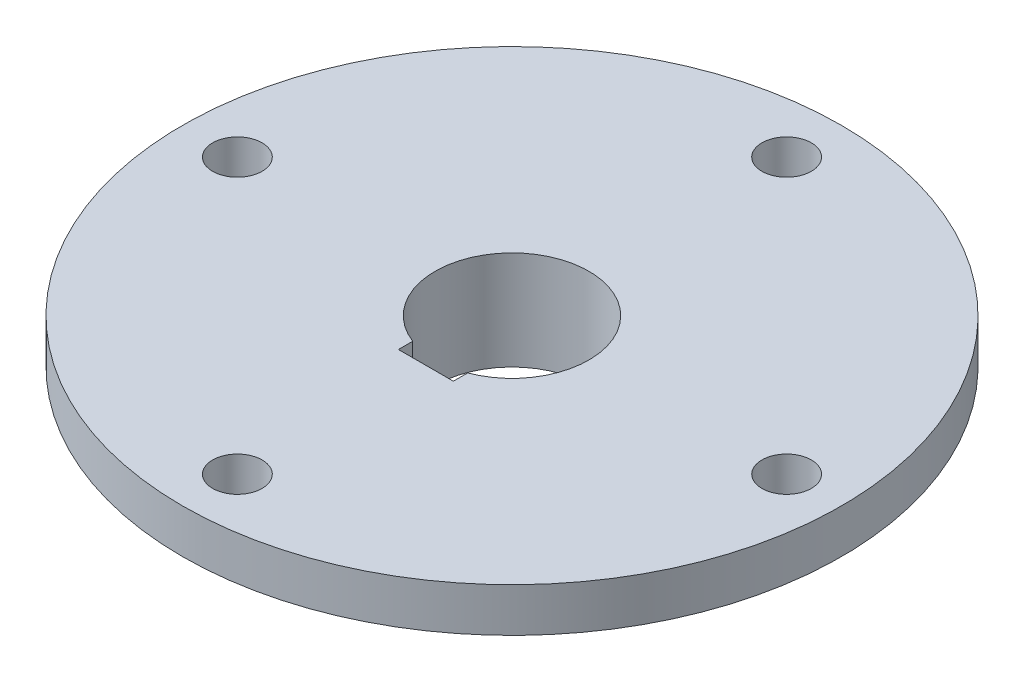
ISO-10303-21;
HEADER;
FILE_DESCRIPTION(('STEP AP214'),'2;1');
FILE_NAME('part.step','',(''),(''),'','','');
FILE_SCHEMA(('AUTOMOTIVE_DESIGN { 1 0 10303 214 1 1 1 1 }'));
ENDSEC;
DATA;
#1=APPLICATION_CONTEXT('core data for automotive mechanical design processes');
#2=APPLICATION_PROTOCOL_DEFINITION('international standard','automotive_design',2000,#1);
#3=PRODUCT_CONTEXT('',#1,'mechanical');
#4=PRODUCT('Part','Part','',(#3));
#5=PRODUCT_RELATED_PRODUCT_CATEGORY('part','',(#4));
#6=PRODUCT_DEFINITION_FORMATION('','',#4);
#7=PRODUCT_DEFINITION_CONTEXT('part definition',#1,'design');
#8=PRODUCT_DEFINITION('design','',#6,#7);
#9=PRODUCT_DEFINITION_SHAPE('','',#8);
#10=(LENGTH_UNIT() NAMED_UNIT(*) SI_UNIT(.MILLI.,.METRE.));
#11=(NAMED_UNIT(*) PLANE_ANGLE_UNIT() SI_UNIT($,.RADIAN.));
#12=(NAMED_UNIT(*) SI_UNIT($,.STERADIAN.) SOLID_ANGLE_UNIT());
#13=UNCERTAINTY_MEASURE_WITH_UNIT(LENGTH_MEASURE(1.E-05),#10,'distance_accuracy_value','');
#14=(GEOMETRIC_REPRESENTATION_CONTEXT(3) GLOBAL_UNCERTAINTY_ASSIGNED_CONTEXT((#13)) GLOBAL_UNIT_ASSIGNED_CONTEXT((#10,
#11,#12)) REPRESENTATION_CONTEXT('',''));
#15=CARTESIAN_POINT('',(0.,0.,0.));
#16=DIRECTION('',(0.,0.,1.));
#17=DIRECTION('',(1.,0.,0.));
#18=AXIS2_PLACEMENT_3D('',#15,#16,#17);
#19=CARTESIAN_POINT('',(0.,0.,0.));
#20=DIRECTION('',(0.,1.,0.));
#21=DIRECTION('',(0.,0.,1.));
#22=AXIS2_PLACEMENT_3D('',#19,#20,#21);
#23=PLANE('',#22);
#24=CARTESIAN_POINT('',(0.,0.,0.));
#25=DIRECTION('',(0.,1.,0.));
#26=DIRECTION('',(0.,0.,1.));
#27=AXIS2_PLACEMENT_3D('',#24,#25,#26);
#28=CIRCLE('',#27,20.5);
#29=CARTESIAN_POINT('',(0.,0.,20.5));
#30=VERTEX_POINT('',#29);
#31=EDGE_CURVE('E50',#30,#30,#28,.T.);
#32=ORIENTED_EDGE('',*,*,#31,.F.);
#33=EDGE_LOOP('',(#32));
#34=FACE_BOUND('',#33,.T.);
#35=CARTESIAN_POINT('',(0.,0.,0.));
#36=DIRECTION('',(0.,1.,0.));
#37=DIRECTION('',(0.,0.,1.));
#38=AXIS2_PLACEMENT_3D('',#35,#36,#37);
#39=CIRCLE('',#38,7.);
#40=CARTESIAN_POINT('',(2.5,0.,6.538348415311));
#41=VERTEX_POINT('',#40);
#42=CARTESIAN_POINT('',(-2.5,0.,6.53834841531101));
#43=VERTEX_POINT('',#42);
#44=EDGE_CURVE('E118',#41,#43,#39,.T.);
#45=ORIENTED_EDGE('',*,*,#44,.T.);
#46=DIRECTION('',(0.,0.,1.));
#47=VECTOR('',#46,1.);
#48=CARTESIAN_POINT('',(-2.5,0.,0.));
#49=LINE('',#48,#47);
#50=CARTESIAN_POINT('',(-2.5,0.,7.83834841531101));
#51=VERTEX_POINT('',#50);
#52=EDGE_CURVE('E89',#43,#51,#49,.T.);
#53=ORIENTED_EDGE('',*,*,#52,.T.);
#54=DIRECTION('',(1.,0.,0.));
#55=VECTOR('',#54,1.);
#56=CARTESIAN_POINT('',(0.,0.,7.83834841531101));
#57=LINE('',#56,#55);
#58=CARTESIAN_POINT('',(2.5,0.,7.838348415311));
#59=VERTEX_POINT('',#58);
#60=EDGE_CURVE('E63',#51,#59,#57,.T.);
#61=ORIENTED_EDGE('',*,*,#60,.T.);
#62=DIRECTION('',(0.,0.,-1.));
#63=VECTOR('',#62,1.);
#64=CARTESIAN_POINT('',(2.5,0.,0.));
#65=LINE('',#64,#63);
#66=EDGE_CURVE('E123',#59,#41,#65,.T.);
#67=ORIENTED_EDGE('',*,*,#66,.T.);
#68=EDGE_LOOP('',(#45,#53,#61,#67));
#69=FACE_BOUND('',#68,.T.);
#70=ADVANCED_FACE('F41',(#34,#69),#23,.F.);
#71=CARTESIAN_POINT('',(0.,5.,0.));
#72=DIRECTION('',(0.,-1.,0.));
#73=DIRECTION('',(0.,0.,-1.));
#74=AXIS2_PLACEMENT_3D('',#71,#72,#73);
#75=CYLINDRICAL_SURFACE('',#74,20.5);
#76=CARTESIAN_POINT('',(0.,5.,0.));
#77=DIRECTION('',(0.,1.,0.));
#78=DIRECTION('',(0.,0.,1.));
#79=AXIS2_PLACEMENT_3D('',#76,#77,#78);
#80=CIRCLE('',#79,20.5);
#81=CARTESIAN_POINT('',(0.,5.,20.5));
#82=VERTEX_POINT('',#81);
#83=EDGE_CURVE('E11',#82,#82,#80,.T.);
#84=ORIENTED_EDGE('',*,*,#83,.F.);
#85=EDGE_LOOP('',(#84));
#86=FACE_BOUND('',#85,.T.);
#87=ORIENTED_EDGE('',*,*,#31,.T.);
#88=EDGE_LOOP('',(#87));
#89=FACE_BOUND('',#88,.T.);
#90=ADVANCED_FACE('F43',(#86,#89),#75,.T.);
#91=CARTESIAN_POINT('',(0.,5.,0.));
#92=DIRECTION('',(0.,-1.,0.));
#93=DIRECTION('',(0.,0.,-1.));
#94=AXIS2_PLACEMENT_3D('',#91,#92,#93);
#95=CYLINDRICAL_SURFACE('',#94,7.);
#96=DIRECTION('',(0.,-1.,0.));
#97=VECTOR('',#96,1.);
#98=CARTESIAN_POINT('',(-2.5,9.,6.53834841531101));
#99=LINE('',#98,#97);
#100=CARTESIAN_POINT('',(-2.5,9.,6.53834841531101));
#101=VERTEX_POINT('',#100);
#102=EDGE_CURVE('E84',#101,#43,#99,.T.);
#103=ORIENTED_EDGE('',*,*,#102,.T.);
#104=ORIENTED_EDGE('',*,*,#44,.F.);
#105=DIRECTION('',(0.,-1.,0.));
#106=VECTOR('',#105,1.);
#107=CARTESIAN_POINT('',(2.5,9.,6.538348415311));
#108=LINE('',#107,#106);
#109=CARTESIAN_POINT('',(2.5,9.,6.538348415311));
#110=VERTEX_POINT('',#109);
#111=EDGE_CURVE('E94',#110,#41,#108,.T.);
#112=ORIENTED_EDGE('',*,*,#111,.F.);
#113=CARTESIAN_POINT('',(0.,9.,0.));
#114=DIRECTION('',(0.,1.,0.));
#115=DIRECTION('',(0.,0.,1.));
#116=AXIS2_PLACEMENT_3D('',#113,#114,#115);
#117=CIRCLE('',#116,7.);
#118=EDGE_CURVE('E101',#110,#101,#117,.T.);
#119=ORIENTED_EDGE('',*,*,#118,.T.);
#120=EDGE_LOOP('',(#103,#104,#112,#119));
#121=FACE_BOUND('',#120,.T.);
#122=ADVANCED_FACE('F105',(#121),#95,.F.);
#123=CARTESIAN_POINT('',(0.,9.,0.));
#124=DIRECTION('',(0.,1.,0.));
#125=DIRECTION('',(0.,0.,1.));
#126=AXIS2_PLACEMENT_3D('',#123,#124,#125);
#127=PLANE('',#126);
#128=DIRECTION('',(0.,0.,-1.));
#129=VECTOR('',#128,1.);
#130=CARTESIAN_POINT('',(-2.5,9.,7.83834841531101));
#131=LINE('',#130,#129);
#132=CARTESIAN_POINT('',(-2.5,9.,7.83834841531101));
#133=VERTEX_POINT('',#132);
#134=EDGE_CURVE('E87',#133,#101,#131,.T.);
#135=ORIENTED_EDGE('',*,*,#134,.T.);
#136=ORIENTED_EDGE('',*,*,#118,.F.);
#137=DIRECTION('',(0.,0.,1.));
#138=VECTOR('',#137,1.);
#139=CARTESIAN_POINT('',(2.5,9.,7.838348415311));
#140=LINE('',#139,#138);
#141=CARTESIAN_POINT('',(2.5,9.,7.838348415311));
#142=VERTEX_POINT('',#141);
#143=EDGE_CURVE('E102',#110,#142,#140,.T.);
#144=ORIENTED_EDGE('',*,*,#143,.T.);
#145=DIRECTION('',(-1.,0.,0.));
#146=VECTOR('',#145,1.);
#147=CARTESIAN_POINT('',(2.5,9.,7.838348415311));
#148=LINE('',#147,#146);
#149=EDGE_CURVE('E58',#142,#133,#148,.T.);
#150=ORIENTED_EDGE('',*,*,#149,.T.);
#151=EDGE_LOOP('',(#135,#136,#144,#150));
#152=FACE_BOUND('',#151,.T.);
#153=CARTESIAN_POINT('',(0.,9.,-25.));
#154=DIRECTION('',(0.,-1.,0.));
#155=DIRECTION('',(0.,0.,-1.));
#156=AXIS2_PLACEMENT_3D('',#153,#154,#155);
#157=CIRCLE('',#156,2.25);
#158=CARTESIAN_POINT('',(0.,9.,-27.25));
#159=VERTEX_POINT('',#158);
#160=EDGE_CURVE('E142',#159,#159,#157,.T.);
#161=ORIENTED_EDGE('',*,*,#160,.T.);
#162=EDGE_LOOP('',(#161));
#163=FACE_BOUND('',#162,.T.);
#164=CARTESIAN_POINT('',(25.,9.,0.));
#165=DIRECTION('',(0.,-1.,0.));
#166=DIRECTION('',(0.,0.,-1.));
#167=AXIS2_PLACEMENT_3D('',#164,#165,#166);
#168=CIRCLE('',#167,2.25);
#169=CARTESIAN_POINT('',(25.,9.,-2.25));
#170=VERTEX_POINT('',#169);
#171=EDGE_CURVE('E148',#170,#170,#168,.T.);
#172=ORIENTED_EDGE('',*,*,#171,.T.);
#173=EDGE_LOOP('',(#172));
#174=FACE_BOUND('',#173,.T.);
#175=CARTESIAN_POINT('',(0.,9.,25.));
#176=DIRECTION('',(0.,-1.,0.));
#177=DIRECTION('',(0.,0.,-1.));
#178=AXIS2_PLACEMENT_3D('',#175,#176,#177);
#179=CIRCLE('',#178,2.25);
#180=CARTESIAN_POINT('',(0.,9.,22.75));
#181=VERTEX_POINT('',#180);
#182=EDGE_CURVE('E154',#181,#181,#179,.T.);
#183=ORIENTED_EDGE('',*,*,#182,.T.);
#184=EDGE_LOOP('',(#183));
#185=FACE_BOUND('',#184,.T.);
#186=CARTESIAN_POINT('',(-25.,9.,0.));
#187=DIRECTION('',(0.,-1.,0.));
#188=DIRECTION('',(0.,0.,-1.));
#189=AXIS2_PLACEMENT_3D('',#186,#187,#188);
#190=CIRCLE('',#189,2.25);
#191=CARTESIAN_POINT('',(-25.,9.,-2.25));
#192=VERTEX_POINT('',#191);
#193=EDGE_CURVE('E107',#192,#192,#190,.T.);
#194=ORIENTED_EDGE('',*,*,#193,.T.);
#195=EDGE_LOOP('',(#194));
#196=FACE_BOUND('',#195,.T.);
#197=CARTESIAN_POINT('',(0.,9.,0.));
#198=DIRECTION('',(0.,1.,0.));
#199=DIRECTION('',(0.,0.,1.));
#200=AXIS2_PLACEMENT_3D('',#197,#198,#199);
#201=CIRCLE('',#200,30.);
#202=CARTESIAN_POINT('',(0.,9.,30.));
#203=VERTEX_POINT('',#202);
#204=EDGE_CURVE('E110',#203,#203,#201,.T.);
#205=ORIENTED_EDGE('',*,*,#204,.T.);
#206=EDGE_LOOP('',(#205));
#207=FACE_BOUND('',#206,.T.);
#208=ADVANCED_FACE('F98',(#152,#163,#174,#185,#196,#207),#127,.T.);
#209=CARTESIAN_POINT('',(0.,5.,0.));
#210=DIRECTION('',(0.,1.,0.));
#211=DIRECTION('',(0.,0.,1.));
#212=AXIS2_PLACEMENT_3D('',#209,#210,#211);
#213=PLANE('',#212);
#214=CARTESIAN_POINT('',(0.,5.,-25.));
#215=DIRECTION('',(0.,-1.,0.));
#216=DIRECTION('',(0.,0.,-1.));
#217=AXIS2_PLACEMENT_3D('',#214,#215,#216);
#218=CIRCLE('',#217,2.25);
#219=CARTESIAN_POINT('',(0.,5.,-27.25));
#220=VERTEX_POINT('',#219);
#221=EDGE_CURVE('E137',#220,#220,#218,.T.);
#222=ORIENTED_EDGE('',*,*,#221,.F.);
#223=EDGE_LOOP('',(#222));
#224=FACE_BOUND('',#223,.T.);
#225=CARTESIAN_POINT('',(25.,5.,0.));
#226=DIRECTION('',(0.,-1.,0.));
#227=DIRECTION('',(0.,0.,-1.));
#228=AXIS2_PLACEMENT_3D('',#225,#226,#227);
#229=CIRCLE('',#228,2.25);
#230=CARTESIAN_POINT('',(25.,5.,-2.25));
#231=VERTEX_POINT('',#230);
#232=EDGE_CURVE('E145',#231,#231,#229,.T.);
#233=ORIENTED_EDGE('',*,*,#232,.F.);
#234=EDGE_LOOP('',(#233));
#235=FACE_BOUND('',#234,.T.);
#236=CARTESIAN_POINT('',(0.,5.,25.));
#237=DIRECTION('',(0.,-1.,0.));
#238=DIRECTION('',(0.,0.,-1.));
#239=AXIS2_PLACEMENT_3D('',#236,#237,#238);
#240=CIRCLE('',#239,2.25);
#241=CARTESIAN_POINT('',(0.,5.,22.75));
#242=VERTEX_POINT('',#241);
#243=EDGE_CURVE('E151',#242,#242,#240,.T.);
#244=ORIENTED_EDGE('',*,*,#243,.F.);
#245=EDGE_LOOP('',(#244));
#246=FACE_BOUND('',#245,.T.);
#247=CARTESIAN_POINT('',(-25.,5.,0.));
#248=DIRECTION('',(0.,-1.,0.));
#249=DIRECTION('',(0.,0.,-1.));
#250=AXIS2_PLACEMENT_3D('',#247,#248,#249);
#251=CIRCLE('',#250,2.25);
#252=CARTESIAN_POINT('',(-25.,5.,-2.25));
#253=VERTEX_POINT('',#252);
#254=EDGE_CURVE('E113',#253,#253,#251,.T.);
#255=ORIENTED_EDGE('',*,*,#254,.F.);
#256=EDGE_LOOP('',(#255));
#257=FACE_BOUND('',#256,.T.);
#258=ORIENTED_EDGE('',*,*,#83,.T.);
#259=EDGE_LOOP('',(#258));
#260=FACE_BOUND('',#259,.T.);
#261=CARTESIAN_POINT('',(0.,5.,0.));
#262=DIRECTION('',(0.,1.,0.));
#263=DIRECTION('',(0.,0.,1.));
#264=AXIS2_PLACEMENT_3D('',#261,#262,#263);
#265=CIRCLE('',#264,30.);
#266=CARTESIAN_POINT('',(0.,5.,30.));
#267=VERTEX_POINT('',#266);
#268=EDGE_CURVE('E106',#267,#267,#265,.T.);
#269=ORIENTED_EDGE('',*,*,#268,.F.);
#270=EDGE_LOOP('',(#269));
#271=FACE_BOUND('',#270,.T.);
#272=ADVANCED_FACE('F161',(#224,#235,#246,#257,#260,#271),#213,.F.);
#273=CARTESIAN_POINT('',(0.,9.,0.));
#274=DIRECTION('',(0.,-1.,0.));
#275=DIRECTION('',(0.,0.,-1.));
#276=AXIS2_PLACEMENT_3D('',#273,#274,#275);
#277=CYLINDRICAL_SURFACE('',#276,30.);
#278=ORIENTED_EDGE('',*,*,#204,.F.);
#279=EDGE_LOOP('',(#278));
#280=FACE_BOUND('',#279,.T.);
#281=ORIENTED_EDGE('',*,*,#268,.T.);
#282=EDGE_LOOP('',(#281));
#283=FACE_BOUND('',#282,.T.);
#284=ADVANCED_FACE('F164',(#280,#283),#277,.T.);
#285=CARTESIAN_POINT('',(-25.,5.,0.));
#286=DIRECTION('',(0.,-1.,0.));
#287=DIRECTION('',(0.,0.,-1.));
#288=AXIS2_PLACEMENT_3D('',#285,#286,#287);
#289=CYLINDRICAL_SURFACE('',#288,2.25);
#290=ORIENTED_EDGE('',*,*,#193,.F.);
#291=EDGE_LOOP('',(#290));
#292=FACE_BOUND('',#291,.T.);
#293=ORIENTED_EDGE('',*,*,#254,.T.);
#294=EDGE_LOOP('',(#293));
#295=FACE_BOUND('',#294,.T.);
#296=ADVANCED_FACE('F159',(#292,#295),#289,.F.);
#297=CARTESIAN_POINT('',(0.,5.,25.));
#298=DIRECTION('',(0.,-1.,0.));
#299=DIRECTION('',(0.,0.,-1.));
#300=AXIS2_PLACEMENT_3D('',#297,#298,#299);
#301=CYLINDRICAL_SURFACE('',#300,2.25);
#302=ORIENTED_EDGE('',*,*,#182,.F.);
#303=EDGE_LOOP('',(#302));
#304=FACE_BOUND('',#303,.T.);
#305=ORIENTED_EDGE('',*,*,#243,.T.);
#306=EDGE_LOOP('',(#305));
#307=FACE_BOUND('',#306,.T.);
#308=ADVANCED_FACE('F178',(#304,#307),#301,.F.);
#309=CARTESIAN_POINT('',(25.,5.,0.));
#310=DIRECTION('',(0.,-1.,0.));
#311=DIRECTION('',(0.,0.,-1.));
#312=AXIS2_PLACEMENT_3D('',#309,#310,#311);
#313=CYLINDRICAL_SURFACE('',#312,2.25);
#314=ORIENTED_EDGE('',*,*,#171,.F.);
#315=EDGE_LOOP('',(#314));
#316=FACE_BOUND('',#315,.T.);
#317=ORIENTED_EDGE('',*,*,#232,.T.);
#318=EDGE_LOOP('',(#317));
#319=FACE_BOUND('',#318,.T.);
#320=ADVANCED_FACE('F201',(#316,#319),#313,.F.);
#321=CARTESIAN_POINT('',(0.,5.,-25.));
#322=DIRECTION('',(0.,-1.,0.));
#323=DIRECTION('',(0.,0.,-1.));
#324=AXIS2_PLACEMENT_3D('',#321,#322,#323);
#325=CYLINDRICAL_SURFACE('',#324,2.25);
#326=ORIENTED_EDGE('',*,*,#160,.F.);
#327=EDGE_LOOP('',(#326));
#328=FACE_BOUND('',#327,.T.);
#329=ORIENTED_EDGE('',*,*,#221,.T.);
#330=EDGE_LOOP('',(#329));
#331=FACE_BOUND('',#330,.T.);
#332=ADVANCED_FACE('F205',(#328,#331),#325,.F.);
#333=CARTESIAN_POINT('',(-2.5,9.,7.83834841531101));
#334=DIRECTION('',(-1.,0.,0.));
#335=DIRECTION('',(0.,0.,1.));
#336=AXIS2_PLACEMENT_3D('',#333,#334,#335);
#337=PLANE('',#336);
#338=ORIENTED_EDGE('',*,*,#102,.F.);
#339=ORIENTED_EDGE('',*,*,#134,.F.);
#340=DIRECTION('',(0.,-1.,0.));
#341=VECTOR('',#340,1.);
#342=CARTESIAN_POINT('',(-2.5,9.,7.83834841531101));
#343=LINE('',#342,#341);
#344=EDGE_CURVE('E125',#133,#51,#343,.T.);
#345=ORIENTED_EDGE('',*,*,#344,.T.);
#346=ORIENTED_EDGE('',*,*,#52,.F.);
#347=EDGE_LOOP('',(#338,#339,#345,#346));
#348=FACE_BOUND('',#347,.T.);
#349=ADVANCED_FACE('F86',(#348),#337,.F.);
#350=CARTESIAN_POINT('',(2.5,9.,7.838348415311));
#351=DIRECTION('',(0.,0.,1.));
#352=DIRECTION('',(1.,0.,0.));
#353=AXIS2_PLACEMENT_3D('',#350,#351,#352);
#354=PLANE('',#353);
#355=ORIENTED_EDGE('',*,*,#344,.F.);
#356=ORIENTED_EDGE('',*,*,#149,.F.);
#357=DIRECTION('',(0.,-1.,0.));
#358=VECTOR('',#357,1.);
#359=CARTESIAN_POINT('',(2.5,9.,7.838348415311));
#360=LINE('',#359,#358);
#361=EDGE_CURVE('E128',#142,#59,#360,.T.);
#362=ORIENTED_EDGE('',*,*,#361,.T.);
#363=ORIENTED_EDGE('',*,*,#60,.F.);
#364=EDGE_LOOP('',(#355,#356,#362,#363));
#365=FACE_BOUND('',#364,.T.);
#366=ADVANCED_FACE('F210',(#365),#354,.F.);
#367=CARTESIAN_POINT('',(2.5,9.,7.838348415311));
#368=DIRECTION('',(1.,0.,0.));
#369=DIRECTION('',(0.,0.,-1.));
#370=AXIS2_PLACEMENT_3D('',#367,#368,#369);
#371=PLANE('',#370);
#372=ORIENTED_EDGE('',*,*,#361,.F.);
#373=ORIENTED_EDGE('',*,*,#143,.F.);
#374=ORIENTED_EDGE('',*,*,#111,.T.);
#375=ORIENTED_EDGE('',*,*,#66,.F.);
#376=EDGE_LOOP('',(#372,#373,#374,#375));
#377=FACE_BOUND('',#376,.T.);
#378=ADVANCED_FACE('F211',(#377),#371,.F.);
#379=CLOSED_SHELL('',(#70,#90,#122,#208,#272,#284,#296,#308,#320,#332,#349,#366,#378));
#380=MANIFOLD_SOLID_BREP('B2',#379);
#381=ADVANCED_BREP_SHAPE_REPRESENTATION('',(#18,#380),#14);
#382=SHAPE_DEFINITION_REPRESENTATION(#9,#381);
ENDSEC;
END-ISO-10303-21;
